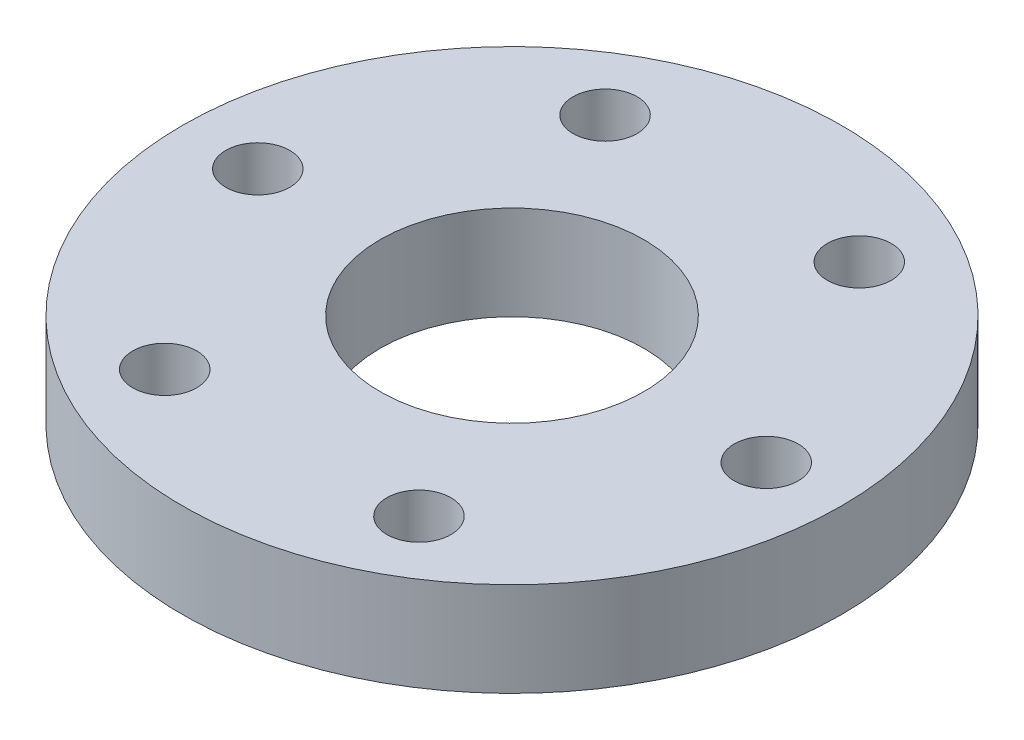
ISO-10303-21;
HEADER;
FILE_DESCRIPTION(('STEP AP214'),'2;1');
FILE_NAME('part.step','',(''),(''),'','','');
FILE_SCHEMA(('AUTOMOTIVE_DESIGN { 1 0 10303 214 1 1 1 1 }'));
ENDSEC;
DATA;
#1=APPLICATION_CONTEXT('core data for automotive mechanical design processes');
#2=APPLICATION_PROTOCOL_DEFINITION('international standard','automotive_design',2000,#1);
#3=PRODUCT_CONTEXT('',#1,'mechanical');
#4=PRODUCT('Part','Part','',(#3));
#5=PRODUCT_RELATED_PRODUCT_CATEGORY('part','',(#4));
#6=PRODUCT_DEFINITION_FORMATION('','',#4);
#7=PRODUCT_DEFINITION_CONTEXT('part definition',#1,'design');
#8=PRODUCT_DEFINITION('design','',#6,#7);
#9=PRODUCT_DEFINITION_SHAPE('','',#8);
#10=(LENGTH_UNIT() NAMED_UNIT(*) SI_UNIT(.MILLI.,.METRE.));
#11=(NAMED_UNIT(*) PLANE_ANGLE_UNIT() SI_UNIT($,.RADIAN.));
#12=(NAMED_UNIT(*) SI_UNIT($,.STERADIAN.) SOLID_ANGLE_UNIT());
#13=UNCERTAINTY_MEASURE_WITH_UNIT(LENGTH_MEASURE(1.E-05),#10,'distance_accuracy_value','');
#14=(GEOMETRIC_REPRESENTATION_CONTEXT(3) GLOBAL_UNCERTAINTY_ASSIGNED_CONTEXT((#13)) GLOBAL_UNIT_ASSIGNED_CONTEXT((#10,
#11,#12)) REPRESENTATION_CONTEXT('',''));
#15=CARTESIAN_POINT('',(0.,0.,0.));
#16=DIRECTION('',(0.,0.,1.));
#17=DIRECTION('',(1.,0.,0.));
#18=AXIS2_PLACEMENT_3D('',#15,#16,#17);
#19=CARTESIAN_POINT('',(0.,0.,0.));
#20=DIRECTION('',(0.,1.,0.));
#21=DIRECTION('',(1.,0.,0.));
#22=AXIS2_PLACEMENT_3D('',#19,#20,#21);
#23=PLANE('',#22);
#24=CARTESIAN_POINT('',(-13.5,0.,0.));
#25=DIRECTION('',(0.,1.,0.));
#26=DIRECTION('',(0.,0.,1.));
#27=AXIS2_PLACEMENT_3D('',#24,#25,#26);
#28=CIRCLE('',#27,1.7);
#29=CARTESIAN_POINT('',(-13.5,0.,1.7));
#30=VERTEX_POINT('',#29);
#31=EDGE_CURVE('E31',#30,#30,#28,.T.);
#32=ORIENTED_EDGE('',*,*,#31,.T.);
#33=EDGE_LOOP('',(#32));
#34=FACE_BOUND('',#33,.T.);
#35=CARTESIAN_POINT('',(-6.75,0.,11.6913429510899));
#36=DIRECTION('',(0.,1.,0.));
#37=DIRECTION('',(0.866025403784439,0.,0.5));
#38=AXIS2_PLACEMENT_3D('',#35,#36,#37);
#39=CIRCLE('',#38,1.7);
#40=CARTESIAN_POINT('',(-5.27775681356645,0.,12.5413429510899));
#41=VERTEX_POINT('',#40);
#42=EDGE_CURVE('E44',#41,#41,#39,.T.);
#43=ORIENTED_EDGE('',*,*,#42,.T.);
#44=EDGE_LOOP('',(#43));
#45=FACE_BOUND('',#44,.T.);
#46=CARTESIAN_POINT('',(6.75,0.,11.6913429510899));
#47=DIRECTION('',(0.,1.,0.));
#48=DIRECTION('',(0.866025403784439,0.,-0.5));
#49=AXIS2_PLACEMENT_3D('',#46,#47,#48);
#50=CIRCLE('',#49,1.7);
#51=CARTESIAN_POINT('',(8.22224318643355,0.,10.8413429510899));
#52=VERTEX_POINT('',#51);
#53=EDGE_CURVE('E49',#52,#52,#50,.T.);
#54=ORIENTED_EDGE('',*,*,#53,.T.);
#55=EDGE_LOOP('',(#54));
#56=FACE_BOUND('',#55,.T.);
#57=CARTESIAN_POINT('',(13.5,0.,0.));
#58=DIRECTION('',(0.,1.,0.));
#59=DIRECTION('',(0.,0.,-1.));
#60=AXIS2_PLACEMENT_3D('',#57,#58,#59);
#61=CIRCLE('',#60,1.7);
#62=CARTESIAN_POINT('',(13.5,0.,-1.7));
#63=VERTEX_POINT('',#62);
#64=EDGE_CURVE('E57',#63,#63,#61,.T.);
#65=ORIENTED_EDGE('',*,*,#64,.T.);
#66=EDGE_LOOP('',(#65));
#67=FACE_BOUND('',#66,.T.);
#68=CARTESIAN_POINT('',(6.75,0.,-11.6913429510899));
#69=DIRECTION('',(0.,1.,0.));
#70=DIRECTION('',(-0.866025403784439,0.,-0.5));
#71=AXIS2_PLACEMENT_3D('',#68,#69,#70);
#72=CIRCLE('',#71,1.7);
#73=CARTESIAN_POINT('',(5.27775681356645,0.,-12.5413429510899));
#74=VERTEX_POINT('',#73);
#75=EDGE_CURVE('E69',#74,#74,#72,.T.);
#76=ORIENTED_EDGE('',*,*,#75,.T.);
#77=EDGE_LOOP('',(#76));
#78=FACE_BOUND('',#77,.T.);
#79=CARTESIAN_POINT('',(-6.75,0.,-11.6913429510899));
#80=DIRECTION('',(0.,1.,0.));
#81=DIRECTION('',(-0.866025403784439,0.,0.5));
#82=AXIS2_PLACEMENT_3D('',#79,#80,#81);
#83=CIRCLE('',#82,1.7);
#84=CARTESIAN_POINT('',(-8.22224318643355,0.,-10.8413429510899));
#85=VERTEX_POINT('',#84);
#86=EDGE_CURVE('E70',#85,#85,#83,.T.);
#87=ORIENTED_EDGE('',*,*,#86,.T.);
#88=EDGE_LOOP('',(#87));
#89=FACE_BOUND('',#88,.T.);
#90=CARTESIAN_POINT('',(0.,0.,0.));
#91=DIRECTION('',(0.,1.,0.));
#92=DIRECTION('',(-1.,0.,0.));
#93=AXIS2_PLACEMENT_3D('',#90,#91,#92);
#94=CIRCLE('',#93,7.);
#95=CARTESIAN_POINT('',(-7.,0.,0.));
#96=VERTEX_POINT('',#95);
#97=EDGE_CURVE('E71',#96,#96,#94,.T.);
#98=ORIENTED_EDGE('',*,*,#97,.T.);
#99=EDGE_LOOP('',(#98));
#100=FACE_BOUND('',#99,.T.);
#101=CARTESIAN_POINT('',(0.,0.,0.));
#102=DIRECTION('',(0.,1.,0.));
#103=DIRECTION('',(1.,0.,0.));
#104=AXIS2_PLACEMENT_3D('',#101,#102,#103);
#105=CIRCLE('',#104,17.5);
#106=CARTESIAN_POINT('',(17.5,0.,0.));
#107=VERTEX_POINT('',#106);
#108=EDGE_CURVE('E10',#107,#107,#105,.T.);
#109=ORIENTED_EDGE('',*,*,#108,.F.);
#110=EDGE_LOOP('',(#109));
#111=FACE_BOUND('',#110,.T.);
#112=ADVANCED_FACE('F15',(#34,#45,#56,#67,#78,#89,#100,#111),#23,.F.);
#113=CARTESIAN_POINT('',(0.,5.,0.));
#114=DIRECTION('',(0.,1.,0.));
#115=DIRECTION('',(1.,0.,0.));
#116=AXIS2_PLACEMENT_3D('',#113,#114,#115);
#117=PLANE('',#116);
#118=CARTESIAN_POINT('',(-13.5,5.,0.));
#119=DIRECTION('',(0.,-1.,0.));
#120=DIRECTION('',(0.,0.,1.));
#121=AXIS2_PLACEMENT_3D('',#118,#119,#120);
#122=CIRCLE('',#121,1.7);
#123=CARTESIAN_POINT('',(-13.5,5.,1.7));
#124=VERTEX_POINT('',#123);
#125=EDGE_CURVE('E38',#124,#124,#122,.T.);
#126=ORIENTED_EDGE('',*,*,#125,.T.);
#127=EDGE_LOOP('',(#126));
#128=FACE_BOUND('',#127,.T.);
#129=CARTESIAN_POINT('',(-6.75,5.,11.6913429510899));
#130=DIRECTION('',(0.,-1.,0.));
#131=DIRECTION('',(0.866025403784439,0.,0.5));
#132=AXIS2_PLACEMENT_3D('',#129,#130,#131);
#133=CIRCLE('',#132,1.7);
#134=CARTESIAN_POINT('',(-5.27775681356645,5.,12.5413429510899));
#135=VERTEX_POINT('',#134);
#136=EDGE_CURVE('E48',#135,#135,#133,.T.);
#137=ORIENTED_EDGE('',*,*,#136,.T.);
#138=EDGE_LOOP('',(#137));
#139=FACE_BOUND('',#138,.T.);
#140=CARTESIAN_POINT('',(6.75,5.,11.6913429510899));
#141=DIRECTION('',(0.,-1.,0.));
#142=DIRECTION('',(0.866025403784439,0.,-0.5));
#143=AXIS2_PLACEMENT_3D('',#140,#141,#142);
#144=CIRCLE('',#143,1.7);
#145=CARTESIAN_POINT('',(8.22224318643355,5.,10.8413429510899));
#146=VERTEX_POINT('',#145);
#147=EDGE_CURVE('E53',#146,#146,#144,.T.);
#148=ORIENTED_EDGE('',*,*,#147,.T.);
#149=EDGE_LOOP('',(#148));
#150=FACE_BOUND('',#149,.T.);
#151=CARTESIAN_POINT('',(13.5,5.,0.));
#152=DIRECTION('',(0.,-1.,0.));
#153=DIRECTION('',(0.,0.,-1.));
#154=AXIS2_PLACEMENT_3D('',#151,#152,#153);
#155=CIRCLE('',#154,1.7);
#156=CARTESIAN_POINT('',(13.5,5.,-1.7));
#157=VERTEX_POINT('',#156);
#158=EDGE_CURVE('E61',#157,#157,#155,.T.);
#159=ORIENTED_EDGE('',*,*,#158,.T.);
#160=EDGE_LOOP('',(#159));
#161=FACE_BOUND('',#160,.T.);
#162=CARTESIAN_POINT('',(6.75,5.,-11.6913429510899));
#163=DIRECTION('',(0.,-1.,0.));
#164=DIRECTION('',(-0.866025403784439,0.,-0.5));
#165=AXIS2_PLACEMENT_3D('',#162,#163,#164);
#166=CIRCLE('',#165,1.7);
#167=CARTESIAN_POINT('',(5.27775681356645,5.,-12.5413429510899));
#168=VERTEX_POINT('',#167);
#169=EDGE_CURVE('E65',#168,#168,#166,.T.);
#170=ORIENTED_EDGE('',*,*,#169,.T.);
#171=EDGE_LOOP('',(#170));
#172=FACE_BOUND('',#171,.T.);
#173=CARTESIAN_POINT('',(-6.75,5.,-11.6913429510899));
#174=DIRECTION('',(0.,-1.,0.));
#175=DIRECTION('',(-0.866025403784439,0.,0.5));
#176=AXIS2_PLACEMENT_3D('',#173,#174,#175);
#177=CIRCLE('',#176,1.7);
#178=CARTESIAN_POINT('',(-8.22224318643355,5.,-10.8413429510899));
#179=VERTEX_POINT('',#178);
#180=EDGE_CURVE('E75',#179,#179,#177,.T.);
#181=ORIENTED_EDGE('',*,*,#180,.T.);
#182=EDGE_LOOP('',(#181));
#183=FACE_BOUND('',#182,.T.);
#184=CARTESIAN_POINT('',(0.,5.,0.));
#185=DIRECTION('',(0.,-1.,0.));
#186=DIRECTION('',(-1.,0.,0.));
#187=AXIS2_PLACEMENT_3D('',#184,#185,#186);
#188=CIRCLE('',#187,7.);
#189=CARTESIAN_POINT('',(-7.,5.,0.));
#190=VERTEX_POINT('',#189);
#191=EDGE_CURVE('E76',#190,#190,#188,.T.);
#192=ORIENTED_EDGE('',*,*,#191,.T.);
#193=EDGE_LOOP('',(#192));
#194=FACE_BOUND('',#193,.T.);
#195=CARTESIAN_POINT('',(0.,5.,0.));
#196=DIRECTION('',(0.,1.,0.));
#197=DIRECTION('',(1.,0.,0.));
#198=AXIS2_PLACEMENT_3D('',#195,#196,#197);
#199=CIRCLE('',#198,17.5);
#200=CARTESIAN_POINT('',(17.5,5.,0.));
#201=VERTEX_POINT('',#200);
#202=EDGE_CURVE('E22',#201,#201,#199,.T.);
#203=ORIENTED_EDGE('',*,*,#202,.T.);
#204=EDGE_LOOP('',(#203));
#205=FACE_BOUND('',#204,.T.);
#206=ADVANCED_FACE('F95',(#128,#139,#150,#161,#172,#183,#194,#205),#117,.T.);
#207=CARTESIAN_POINT('',(0.,0.,0.));
#208=DIRECTION('',(0.,1.,0.));
#209=DIRECTION('',(1.,0.,0.));
#210=AXIS2_PLACEMENT_3D('',#207,#208,#209);
#211=CYLINDRICAL_SURFACE('',#210,17.5);
#212=ORIENTED_EDGE('',*,*,#108,.T.);
#213=EDGE_LOOP('',(#212));
#214=FACE_BOUND('',#213,.T.);
#215=ORIENTED_EDGE('',*,*,#202,.F.);
#216=EDGE_LOOP('',(#215));
#217=FACE_BOUND('',#216,.T.);
#218=ADVANCED_FACE('F121',(#214,#217),#211,.T.);
#219=CARTESIAN_POINT('',(-13.5,2.5,0.));
#220=DIRECTION('',(0.,-1.,0.));
#221=DIRECTION('',(0.,0.,1.));
#222=AXIS2_PLACEMENT_3D('',#219,#220,#221);
#223=CYLINDRICAL_SURFACE('',#222,1.7);
#224=ORIENTED_EDGE('',*,*,#31,.F.);
#225=EDGE_LOOP('',(#224));
#226=FACE_BOUND('',#225,.T.);
#227=ORIENTED_EDGE('',*,*,#125,.F.);
#228=EDGE_LOOP('',(#227));
#229=FACE_BOUND('',#228,.T.);
#230=ADVANCED_FACE('F154',(#226,#229),#223,.F.);
#231=CARTESIAN_POINT('',(-6.75,2.5,11.6913429510899));
#232=DIRECTION('',(0.,-1.,0.));
#233=DIRECTION('',(0.866025403784439,0.,0.5));
#234=AXIS2_PLACEMENT_3D('',#231,#232,#233);
#235=CYLINDRICAL_SURFACE('',#234,1.7);
#236=ORIENTED_EDGE('',*,*,#42,.F.);
#237=EDGE_LOOP('',(#236));
#238=FACE_BOUND('',#237,.T.);
#239=ORIENTED_EDGE('',*,*,#136,.F.);
#240=EDGE_LOOP('',(#239));
#241=FACE_BOUND('',#240,.T.);
#242=ADVANCED_FACE('F150',(#238,#241),#235,.F.);
#243=CARTESIAN_POINT('',(6.75,2.5,11.6913429510899));
#244=DIRECTION('',(0.,-1.,0.));
#245=DIRECTION('',(0.866025403784439,0.,-0.5));
#246=AXIS2_PLACEMENT_3D('',#243,#244,#245);
#247=CYLINDRICAL_SURFACE('',#246,1.7);
#248=ORIENTED_EDGE('',*,*,#53,.F.);
#249=EDGE_LOOP('',(#248));
#250=FACE_BOUND('',#249,.T.);
#251=ORIENTED_EDGE('',*,*,#147,.F.);
#252=EDGE_LOOP('',(#251));
#253=FACE_BOUND('',#252,.T.);
#254=ADVANCED_FACE('F144',(#250,#253),#247,.F.);
#255=CARTESIAN_POINT('',(13.5,2.5,0.));
#256=DIRECTION('',(0.,-1.,0.));
#257=DIRECTION('',(0.,0.,-1.));
#258=AXIS2_PLACEMENT_3D('',#255,#256,#257);
#259=CYLINDRICAL_SURFACE('',#258,1.7);
#260=ORIENTED_EDGE('',*,*,#64,.F.);
#261=EDGE_LOOP('',(#260));
#262=FACE_BOUND('',#261,.T.);
#263=ORIENTED_EDGE('',*,*,#158,.F.);
#264=EDGE_LOOP('',(#263));
#265=FACE_BOUND('',#264,.T.);
#266=ADVANCED_FACE('F111',(#262,#265),#259,.F.);
#267=CARTESIAN_POINT('',(6.75,2.5,-11.6913429510899));
#268=DIRECTION('',(0.,-1.,0.));
#269=DIRECTION('',(-0.866025403784439,0.,-0.5));
#270=AXIS2_PLACEMENT_3D('',#267,#268,#269);
#271=CYLINDRICAL_SURFACE('',#270,1.7);
#272=ORIENTED_EDGE('',*,*,#75,.F.);
#273=EDGE_LOOP('',(#272));
#274=FACE_BOUND('',#273,.T.);
#275=ORIENTED_EDGE('',*,*,#169,.F.);
#276=EDGE_LOOP('',(#275));
#277=FACE_BOUND('',#276,.T.);
#278=ADVANCED_FACE('F101',(#274,#277),#271,.F.);
#279=CARTESIAN_POINT('',(-6.75,2.5,-11.6913429510899));
#280=DIRECTION('',(0.,-1.,0.));
#281=DIRECTION('',(-0.866025403784439,0.,0.5));
#282=AXIS2_PLACEMENT_3D('',#279,#280,#281);
#283=CYLINDRICAL_SURFACE('',#282,1.7);
#284=ORIENTED_EDGE('',*,*,#86,.F.);
#285=EDGE_LOOP('',(#284));
#286=FACE_BOUND('',#285,.T.);
#287=ORIENTED_EDGE('',*,*,#180,.F.);
#288=EDGE_LOOP('',(#287));
#289=FACE_BOUND('',#288,.T.);
#290=ADVANCED_FACE('F98',(#286,#289),#283,.F.);
#291=CARTESIAN_POINT('',(0.,5.,0.));
#292=DIRECTION('',(0.,-1.,0.));
#293=DIRECTION('',(-1.,0.,0.));
#294=AXIS2_PLACEMENT_3D('',#291,#292,#293);
#295=CYLINDRICAL_SURFACE('',#294,7.);
#296=ORIENTED_EDGE('',*,*,#97,.F.);
#297=EDGE_LOOP('',(#296));
#298=FACE_BOUND('',#297,.T.);
#299=ORIENTED_EDGE('',*,*,#191,.F.);
#300=EDGE_LOOP('',(#299));
#301=FACE_BOUND('',#300,.T.);
#302=ADVANCED_FACE('F100',(#298,#301),#295,.F.);
#303=CLOSED_SHELL('',(#112,#206,#218,#230,#242,#254,#266,#278,#290,#302));
#304=MANIFOLD_SOLID_BREP('B1',#303);
#305=ADVANCED_BREP_SHAPE_REPRESENTATION('',(#18,#304),#14);
#306=SHAPE_DEFINITION_REPRESENTATION(#9,#305);
ENDSEC;
END-ISO-10303-21;
